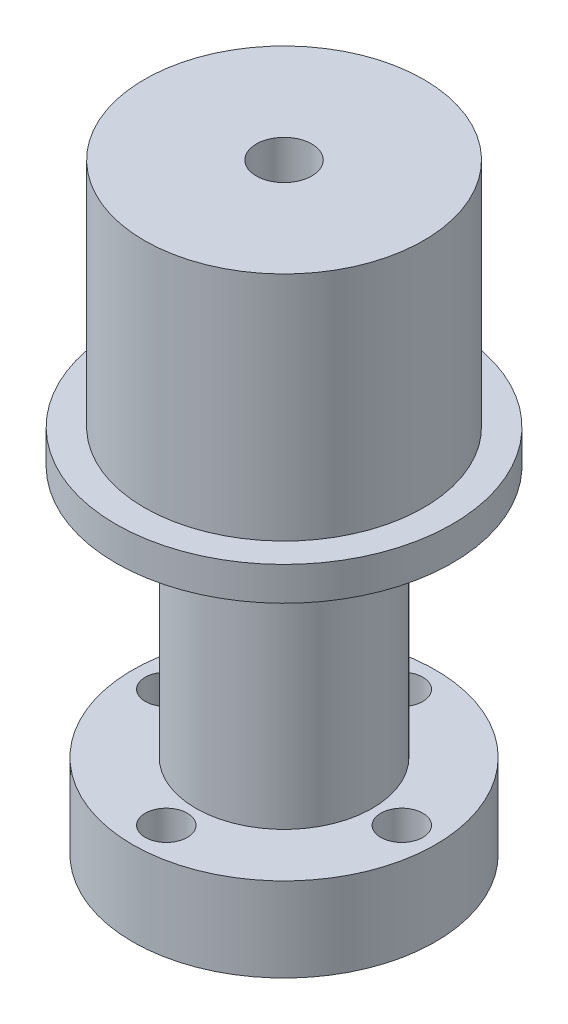
ISO-10303-21;
HEADER;
FILE_DESCRIPTION(('STEP AP214'),'2;1');
FILE_NAME('part.step','',(''),(''),'','','');
FILE_SCHEMA(('AUTOMOTIVE_DESIGN { 1 0 10303 214 1 1 1 1 }'));
ENDSEC;
DATA;
#1=APPLICATION_CONTEXT('core data for automotive mechanical design processes');
#2=APPLICATION_PROTOCOL_DEFINITION('international standard','automotive_design',2000,#1);
#3=PRODUCT_CONTEXT('',#1,'mechanical');
#4=PRODUCT('Part','Part','',(#3));
#5=PRODUCT_RELATED_PRODUCT_CATEGORY('part','',(#4));
#6=PRODUCT_DEFINITION_FORMATION('','',#4);
#7=PRODUCT_DEFINITION_CONTEXT('part definition',#1,'design');
#8=PRODUCT_DEFINITION('design','',#6,#7);
#9=PRODUCT_DEFINITION_SHAPE('','',#8);
#10=(LENGTH_UNIT() NAMED_UNIT(*) SI_UNIT(.MILLI.,.METRE.));
#11=(NAMED_UNIT(*) PLANE_ANGLE_UNIT() SI_UNIT($,.RADIAN.));
#12=(NAMED_UNIT(*) SI_UNIT($,.STERADIAN.) SOLID_ANGLE_UNIT());
#13=UNCERTAINTY_MEASURE_WITH_UNIT(LENGTH_MEASURE(1.E-05),#10,'distance_accuracy_value','');
#14=(GEOMETRIC_REPRESENTATION_CONTEXT(3) GLOBAL_UNCERTAINTY_ASSIGNED_CONTEXT((#13)) GLOBAL_UNIT_ASSIGNED_CONTEXT((#10,
#11,#12)) REPRESENTATION_CONTEXT('',''));
#15=CARTESIAN_POINT('',(0.,0.,0.));
#16=DIRECTION('',(0.,0.,1.));
#17=DIRECTION('',(1.,0.,0.));
#18=AXIS2_PLACEMENT_3D('',#15,#16,#17);
#19=CARTESIAN_POINT('',(0.,0.,0.));
#20=DIRECTION('',(0.,1.,0.));
#21=DIRECTION('',(0.,0.,1.));
#22=AXIS2_PLACEMENT_3D('',#19,#20,#21);
#23=PLANE('',#22);
#24=CARTESIAN_POINT('',(0.,0.,0.));
#25=DIRECTION('',(0.,-1.,0.));
#26=DIRECTION('',(0.,0.,-1.));
#27=AXIS2_PLACEMENT_3D('',#24,#25,#26);
#28=CIRCLE('',#27,5.);
#29=CARTESIAN_POINT('',(0.,0.,-5.));
#30=VERTEX_POINT('',#29);
#31=EDGE_CURVE('E11',#30,#30,#28,.T.);
#32=ORIENTED_EDGE('',*,*,#31,.F.);
#33=EDGE_LOOP('',(#32));
#34=FACE_BOUND('',#33,.T.);
#35=CARTESIAN_POINT('',(0.,0.,-7.));
#36=DIRECTION('',(0.,-1.,0.));
#37=DIRECTION('',(0.,0.,-1.));
#38=AXIS2_PLACEMENT_3D('',#35,#36,#37);
#39=CIRCLE('',#38,1.24999999999999);
#40=CARTESIAN_POINT('',(0.,0.,-8.24999999999999));
#41=VERTEX_POINT('',#40);
#42=EDGE_CURVE('E73',#41,#41,#39,.T.);
#43=ORIENTED_EDGE('',*,*,#42,.F.);
#44=EDGE_LOOP('',(#43));
#45=FACE_BOUND('',#44,.T.);
#46=CARTESIAN_POINT('',(7.,0.,0.));
#47=DIRECTION('',(0.,-1.,0.));
#48=DIRECTION('',(0.,0.,-1.));
#49=AXIS2_PLACEMENT_3D('',#46,#47,#48);
#50=CIRCLE('',#49,1.24999999999999);
#51=CARTESIAN_POINT('',(7.,0.,-1.24999999999999));
#52=VERTEX_POINT('',#51);
#53=EDGE_CURVE('E85',#52,#52,#50,.T.);
#54=ORIENTED_EDGE('',*,*,#53,.F.);
#55=EDGE_LOOP('',(#54));
#56=FACE_BOUND('',#55,.T.);
#57=CARTESIAN_POINT('',(0.,0.,7.));
#58=DIRECTION('',(0.,-1.,0.));
#59=DIRECTION('',(0.,0.,-1.));
#60=AXIS2_PLACEMENT_3D('',#57,#58,#59);
#61=CIRCLE('',#60,1.24999999999999);
#62=CARTESIAN_POINT('',(0.,0.,5.75000000000001));
#63=VERTEX_POINT('',#62);
#64=EDGE_CURVE('E101',#63,#63,#61,.T.);
#65=ORIENTED_EDGE('',*,*,#64,.F.);
#66=EDGE_LOOP('',(#65));
#67=FACE_BOUND('',#66,.T.);
#68=CARTESIAN_POINT('',(0.,0.,0.));
#69=DIRECTION('',(0.,1.,0.));
#70=DIRECTION('',(0.,0.,1.));
#71=AXIS2_PLACEMENT_3D('',#68,#69,#70);
#72=CIRCLE('',#71,9.);
#73=CARTESIAN_POINT('',(0.,0.,9.));
#74=VERTEX_POINT('',#73);
#75=EDGE_CURVE('E47',#74,#74,#72,.T.);
#76=ORIENTED_EDGE('',*,*,#75,.F.);
#77=EDGE_LOOP('',(#76));
#78=FACE_BOUND('',#77,.T.);
#79=CARTESIAN_POINT('',(-7.,0.,0.));
#80=DIRECTION('',(0.,-1.,0.));
#81=DIRECTION('',(0.,0.,-1.));
#82=AXIS2_PLACEMENT_3D('',#79,#80,#81);
#83=CIRCLE('',#82,1.24999999999999);
#84=CARTESIAN_POINT('',(-7.,0.,-1.24999999999999));
#85=VERTEX_POINT('',#84);
#86=EDGE_CURVE('E93',#85,#85,#83,.T.);
#87=ORIENTED_EDGE('',*,*,#86,.F.);
#88=EDGE_LOOP('',(#87));
#89=FACE_BOUND('',#88,.T.);
#90=ADVANCED_FACE('F43',(#34,#45,#56,#67,#78,#89),#23,.F.);
#91=CARTESIAN_POINT('',(0.,5.,0.));
#92=DIRECTION('',(0.,-1.,0.));
#93=DIRECTION('',(0.,0.,-1.));
#94=AXIS2_PLACEMENT_3D('',#91,#92,#93);
#95=CYLINDRICAL_SURFACE('',#94,9.);
#96=CARTESIAN_POINT('',(0.,5.,0.));
#97=DIRECTION('',(0.,1.,0.));
#98=DIRECTION('',(0.,0.,1.));
#99=AXIS2_PLACEMENT_3D('',#96,#97,#98);
#100=CIRCLE('',#99,9.);
#101=CARTESIAN_POINT('',(0.,5.,9.));
#102=VERTEX_POINT('',#101);
#103=EDGE_CURVE('E131',#102,#102,#100,.T.);
#104=ORIENTED_EDGE('',*,*,#103,.F.);
#105=EDGE_LOOP('',(#104));
#106=FACE_BOUND('',#105,.T.);
#107=ORIENTED_EDGE('',*,*,#75,.T.);
#108=EDGE_LOOP('',(#107));
#109=FACE_BOUND('',#108,.T.);
#110=ADVANCED_FACE('F45',(#106,#109),#95,.T.);
#111=CARTESIAN_POINT('',(0.,5.,0.));
#112=DIRECTION('',(0.,1.,0.));
#113=DIRECTION('',(0.,0.,1.));
#114=AXIS2_PLACEMENT_3D('',#111,#112,#113);
#115=PLANE('',#114);
#116=CARTESIAN_POINT('',(0.,5.,-7.));
#117=DIRECTION('',(0.,1.,0.));
#118=DIRECTION('',(0.,0.,1.));
#119=AXIS2_PLACEMENT_3D('',#116,#117,#118);
#120=CIRCLE('',#119,1.24999999999999);
#121=CARTESIAN_POINT('',(0.,5.,-5.75000000000001));
#122=VERTEX_POINT('',#121);
#123=EDGE_CURVE('E81',#122,#122,#120,.T.);
#124=ORIENTED_EDGE('',*,*,#123,.F.);
#125=EDGE_LOOP('',(#124));
#126=FACE_BOUND('',#125,.T.);
#127=CARTESIAN_POINT('',(7.,5.,0.));
#128=DIRECTION('',(0.,1.,0.));
#129=DIRECTION('',(0.,0.,1.));
#130=AXIS2_PLACEMENT_3D('',#127,#128,#129);
#131=CIRCLE('',#130,1.24999999999999);
#132=CARTESIAN_POINT('',(7.,5.,1.25));
#133=VERTEX_POINT('',#132);
#134=EDGE_CURVE('E89',#133,#133,#131,.T.);
#135=ORIENTED_EDGE('',*,*,#134,.F.);
#136=EDGE_LOOP('',(#135));
#137=FACE_BOUND('',#136,.T.);
#138=CARTESIAN_POINT('',(-7.,5.,0.));
#139=DIRECTION('',(0.,1.,0.));
#140=DIRECTION('',(0.,0.,1.));
#141=AXIS2_PLACEMENT_3D('',#138,#139,#140);
#142=CIRCLE('',#141,1.24999999999999);
#143=CARTESIAN_POINT('',(-7.,5.,1.24999999999999));
#144=VERTEX_POINT('',#143);
#145=EDGE_CURVE('E97',#144,#144,#142,.T.);
#146=ORIENTED_EDGE('',*,*,#145,.F.);
#147=EDGE_LOOP('',(#146));
#148=FACE_BOUND('',#147,.T.);
#149=CARTESIAN_POINT('',(0.,5.,7.));
#150=DIRECTION('',(0.,1.,0.));
#151=DIRECTION('',(0.,0.,1.));
#152=AXIS2_PLACEMENT_3D('',#149,#150,#151);
#153=CIRCLE('',#152,1.24999999999999);
#154=CARTESIAN_POINT('',(0.,5.,8.24999999999999));
#155=VERTEX_POINT('',#154);
#156=EDGE_CURVE('E105',#155,#155,#153,.T.);
#157=ORIENTED_EDGE('',*,*,#156,.F.);
#158=EDGE_LOOP('',(#157));
#159=FACE_BOUND('',#158,.T.);
#160=CARTESIAN_POINT('',(0.,5.,0.));
#161=DIRECTION('',(0.,1.,0.));
#162=DIRECTION('',(0.,0.,1.));
#163=AXIS2_PLACEMENT_3D('',#160,#161,#162);
#164=CIRCLE('',#163,5.25);
#165=CARTESIAN_POINT('',(0.,5.,5.25));
#166=VERTEX_POINT('',#165);
#167=EDGE_CURVE('E117',#166,#166,#164,.T.);
#168=ORIENTED_EDGE('',*,*,#167,.F.);
#169=EDGE_LOOP('',(#168));
#170=FACE_BOUND('',#169,.T.);
#171=ORIENTED_EDGE('',*,*,#103,.T.);
#172=EDGE_LOOP('',(#171));
#173=FACE_BOUND('',#172,.T.);
#174=ADVANCED_FACE('F154',(#126,#137,#148,#159,#170,#173),#115,.T.);
#175=CARTESIAN_POINT('',(0.,20.,0.));
#176=DIRECTION('',(0.,-1.,0.));
#177=DIRECTION('',(0.,0.,-1.));
#178=AXIS2_PLACEMENT_3D('',#175,#176,#177);
#179=CYLINDRICAL_SURFACE('',#178,5.25);
#180=CARTESIAN_POINT('',(0.,20.,0.));
#181=DIRECTION('',(0.,1.,0.));
#182=DIRECTION('',(0.,0.,1.));
#183=AXIS2_PLACEMENT_3D('',#180,#181,#182);
#184=CIRCLE('',#183,5.25);
#185=CARTESIAN_POINT('',(0.,20.,5.25));
#186=VERTEX_POINT('',#185);
#187=EDGE_CURVE('E122',#186,#186,#184,.T.);
#188=ORIENTED_EDGE('',*,*,#187,.F.);
#189=EDGE_LOOP('',(#188));
#190=FACE_BOUND('',#189,.T.);
#191=ORIENTED_EDGE('',*,*,#167,.T.);
#192=EDGE_LOOP('',(#191));
#193=FACE_BOUND('',#192,.T.);
#194=ADVANCED_FACE('F157',(#190,#193),#179,.T.);
#195=CARTESIAN_POINT('',(0.,22.,0.));
#196=DIRECTION('',(0.,-1.,0.));
#197=DIRECTION('',(0.,0.,-1.));
#198=AXIS2_PLACEMENT_3D('',#195,#196,#197);
#199=CYLINDRICAL_SURFACE('',#198,10.);
#200=CARTESIAN_POINT('',(0.,22.,0.));
#201=DIRECTION('',(0.,1.,0.));
#202=DIRECTION('',(0.,0.,1.));
#203=AXIS2_PLACEMENT_3D('',#200,#201,#202);
#204=CIRCLE('',#203,10.);
#205=CARTESIAN_POINT('',(0.,22.,10.));
#206=VERTEX_POINT('',#205);
#207=EDGE_CURVE('E118',#206,#206,#204,.T.);
#208=ORIENTED_EDGE('',*,*,#207,.F.);
#209=EDGE_LOOP('',(#208));
#210=FACE_BOUND('',#209,.T.);
#211=CARTESIAN_POINT('',(0.,20.,0.));
#212=DIRECTION('',(0.,1.,0.));
#213=DIRECTION('',(0.,0.,1.));
#214=AXIS2_PLACEMENT_3D('',#211,#212,#213);
#215=CIRCLE('',#214,10.);
#216=CARTESIAN_POINT('',(0.,20.,10.));
#217=VERTEX_POINT('',#216);
#218=EDGE_CURVE('E113',#217,#217,#215,.T.);
#219=ORIENTED_EDGE('',*,*,#218,.T.);
#220=EDGE_LOOP('',(#219));
#221=FACE_BOUND('',#220,.T.);
#222=ADVANCED_FACE('F165',(#210,#221),#199,.T.);
#223=CARTESIAN_POINT('',(0.,22.,0.));
#224=DIRECTION('',(0.,1.,0.));
#225=DIRECTION('',(0.,0.,1.));
#226=AXIS2_PLACEMENT_3D('',#223,#224,#225);
#227=PLANE('',#226);
#228=CARTESIAN_POINT('',(0.,22.,0.));
#229=DIRECTION('',(0.,1.,0.));
#230=DIRECTION('',(0.,0.,1.));
#231=AXIS2_PLACEMENT_3D('',#228,#229,#230);
#232=CIRCLE('',#231,8.3);
#233=CARTESIAN_POINT('',(0.,22.,8.3));
#234=VERTEX_POINT('',#233);
#235=EDGE_CURVE('E52',#234,#234,#232,.T.);
#236=ORIENTED_EDGE('',*,*,#235,.F.);
#237=EDGE_LOOP('',(#236));
#238=FACE_BOUND('',#237,.T.);
#239=ORIENTED_EDGE('',*,*,#207,.T.);
#240=EDGE_LOOP('',(#239));
#241=FACE_BOUND('',#240,.T.);
#242=ADVANCED_FACE('F171',(#238,#241),#227,.T.);
#243=CARTESIAN_POINT('',(0.,20.,0.));
#244=DIRECTION('',(0.,1.,0.));
#245=DIRECTION('',(0.,0.,1.));
#246=AXIS2_PLACEMENT_3D('',#243,#244,#245);
#247=PLANE('',#246);
#248=ORIENTED_EDGE('',*,*,#187,.T.);
#249=EDGE_LOOP('',(#248));
#250=FACE_BOUND('',#249,.T.);
#251=ORIENTED_EDGE('',*,*,#218,.F.);
#252=EDGE_LOOP('',(#251));
#253=FACE_BOUND('',#252,.T.);
#254=ADVANCED_FACE('F176',(#250,#253),#247,.F.);
#255=CARTESIAN_POINT('',(0.,35.75,0.));
#256=DIRECTION('',(0.,-1.,0.));
#257=DIRECTION('',(0.,0.,-1.));
#258=AXIS2_PLACEMENT_3D('',#255,#256,#257);
#259=CYLINDRICAL_SURFACE('',#258,8.3);
#260=CARTESIAN_POINT('',(0.,35.75,0.));
#261=DIRECTION('',(0.,1.,0.));
#262=DIRECTION('',(0.,0.,1.));
#263=AXIS2_PLACEMENT_3D('',#260,#261,#262);
#264=CIRCLE('',#263,8.3);
#265=CARTESIAN_POINT('',(0.,35.75,8.3));
#266=VERTEX_POINT('',#265);
#267=EDGE_CURVE('E109',#266,#266,#264,.T.);
#268=ORIENTED_EDGE('',*,*,#267,.F.);
#269=EDGE_LOOP('',(#268));
#270=FACE_BOUND('',#269,.T.);
#271=ORIENTED_EDGE('',*,*,#235,.T.);
#272=EDGE_LOOP('',(#271));
#273=FACE_BOUND('',#272,.T.);
#274=ADVANCED_FACE('F179',(#270,#273),#259,.T.);
#275=CARTESIAN_POINT('',(0.,35.75,0.));
#276=DIRECTION('',(0.,1.,0.));
#277=DIRECTION('',(0.,0.,1.));
#278=AXIS2_PLACEMENT_3D('',#275,#276,#277);
#279=PLANE('',#278);
#280=CARTESIAN_POINT('',(0.,35.75,0.));
#281=DIRECTION('',(0.,1.,0.));
#282=DIRECTION('',(0.,0.,1.));
#283=AXIS2_PLACEMENT_3D('',#280,#281,#282);
#284=CIRCLE('',#283,1.65);
#285=CARTESIAN_POINT('',(0.,35.75,1.65));
#286=VERTEX_POINT('',#285);
#287=EDGE_CURVE('E68',#286,#286,#284,.T.);
#288=ORIENTED_EDGE('',*,*,#287,.F.);
#289=EDGE_LOOP('',(#288));
#290=FACE_BOUND('',#289,.T.);
#291=ORIENTED_EDGE('',*,*,#267,.T.);
#292=EDGE_LOOP('',(#291));
#293=FACE_BOUND('',#292,.T.);
#294=ADVANCED_FACE('F186',(#290,#293),#279,.T.);
#295=CARTESIAN_POINT('',(0.,0.,7.));
#296=DIRECTION('',(0.,-1.,0.));
#297=DIRECTION('',(0.,0.,-1.));
#298=AXIS2_PLACEMENT_3D('',#295,#296,#297);
#299=CYLINDRICAL_SURFACE('',#298,1.24999999999999);
#300=ORIENTED_EDGE('',*,*,#64,.T.);
#301=EDGE_LOOP('',(#300));
#302=FACE_BOUND('',#301,.T.);
#303=ORIENTED_EDGE('',*,*,#156,.T.);
#304=EDGE_LOOP('',(#303));
#305=FACE_BOUND('',#304,.T.);
#306=ADVANCED_FACE('F150',(#302,#305),#299,.F.);
#307=CARTESIAN_POINT('',(-7.,0.,0.));
#308=DIRECTION('',(0.,-1.,0.));
#309=DIRECTION('',(0.,0.,-1.));
#310=AXIS2_PLACEMENT_3D('',#307,#308,#309);
#311=CYLINDRICAL_SURFACE('',#310,1.24999999999999);
#312=ORIENTED_EDGE('',*,*,#86,.T.);
#313=EDGE_LOOP('',(#312));
#314=FACE_BOUND('',#313,.T.);
#315=ORIENTED_EDGE('',*,*,#145,.T.);
#316=EDGE_LOOP('',(#315));
#317=FACE_BOUND('',#316,.T.);
#318=ADVANCED_FACE('F146',(#314,#317),#311,.F.);
#319=CARTESIAN_POINT('',(7.,0.,0.));
#320=DIRECTION('',(0.,-1.,0.));
#321=DIRECTION('',(0.,0.,-1.));
#322=AXIS2_PLACEMENT_3D('',#319,#320,#321);
#323=CYLINDRICAL_SURFACE('',#322,1.24999999999999);
#324=ORIENTED_EDGE('',*,*,#53,.T.);
#325=EDGE_LOOP('',(#324));
#326=FACE_BOUND('',#325,.T.);
#327=ORIENTED_EDGE('',*,*,#134,.T.);
#328=EDGE_LOOP('',(#327));
#329=FACE_BOUND('',#328,.T.);
#330=ADVANCED_FACE('F149',(#326,#329),#323,.F.);
#331=CARTESIAN_POINT('',(0.,0.,-7.));
#332=DIRECTION('',(0.,-1.,0.));
#333=DIRECTION('',(0.,0.,-1.));
#334=AXIS2_PLACEMENT_3D('',#331,#332,#333);
#335=CYLINDRICAL_SURFACE('',#334,1.24999999999999);
#336=ORIENTED_EDGE('',*,*,#42,.T.);
#337=EDGE_LOOP('',(#336));
#338=FACE_BOUND('',#337,.T.);
#339=ORIENTED_EDGE('',*,*,#123,.T.);
#340=EDGE_LOOP('',(#339));
#341=FACE_BOUND('',#340,.T.);
#342=ADVANCED_FACE('F196',(#338,#341),#335,.F.);
#343=CARTESIAN_POINT('',(0.,-2.,0.));
#344=DIRECTION('',(0.,1.,0.));
#345=DIRECTION('',(0.,0.,1.));
#346=AXIS2_PLACEMENT_3D('',#343,#344,#345);
#347=CYLINDRICAL_SURFACE('',#346,5.);
#348=CARTESIAN_POINT('',(0.,-2.,0.));
#349=DIRECTION('',(0.,-1.,0.));
#350=DIRECTION('',(0.,0.,-1.));
#351=AXIS2_PLACEMENT_3D('',#348,#349,#350);
#352=CIRCLE('',#351,5.);
#353=CARTESIAN_POINT('',(0.,-2.,-5.));
#354=VERTEX_POINT('',#353);
#355=EDGE_CURVE('E67',#354,#354,#352,.T.);
#356=ORIENTED_EDGE('',*,*,#355,.F.);
#357=EDGE_LOOP('',(#356));
#358=FACE_BOUND('',#357,.T.);
#359=ORIENTED_EDGE('',*,*,#31,.T.);
#360=EDGE_LOOP('',(#359));
#361=FACE_BOUND('',#360,.T.);
#362=ADVANCED_FACE('F200',(#358,#361),#347,.T.);
#363=CARTESIAN_POINT('',(0.,-2.,0.));
#364=DIRECTION('',(0.,-1.,0.));
#365=DIRECTION('',(0.,0.,-1.));
#366=AXIS2_PLACEMENT_3D('',#363,#364,#365);
#367=PLANE('',#366);
#368=ORIENTED_EDGE('',*,*,#355,.T.);
#369=EDGE_LOOP('',(#368));
#370=FACE_BOUND('',#369,.T.);
#371=ADVANCED_FACE('F60',(#370),#367,.T.);
#372=CARTESIAN_POINT('',(0.,25.65,0.));
#373=DIRECTION('',(0.,1.,0.));
#374=DIRECTION('',(0.,0.,1.));
#375=AXIS2_PLACEMENT_3D('',#372,#373,#374);
#376=CONICAL_SURFACE('',#375,1.65,1.02974425867665);
#377=CARTESIAN_POINT('',(0.,24.6585799786045,0.));
#378=VERTEX_POINT('',#377);
#379=VERTEX_LOOP('',#378);
#380=FACE_BOUND('',#379,.T.);
#381=CARTESIAN_POINT('',(0.,25.65,0.));
#382=DIRECTION('',(0.,1.,0.));
#383=DIRECTION('',(0.,0.,1.));
#384=AXIS2_PLACEMENT_3D('',#381,#382,#383);
#385=CIRCLE('',#384,1.65);
#386=CARTESIAN_POINT('',(0.,25.65,1.65));
#387=VERTEX_POINT('',#386);
#388=EDGE_CURVE('E64',#387,#387,#385,.T.);
#389=ORIENTED_EDGE('',*,*,#388,.T.);
#390=EDGE_LOOP('',(#389));
#391=FACE_BOUND('',#390,.T.);
#392=ADVANCED_FACE('F56',(#380,#391),#376,.F.);
#393=CARTESIAN_POINT('',(0.,35.75,0.));
#394=DIRECTION('',(0.,1.,0.));
#395=DIRECTION('',(0.,0.,1.));
#396=AXIS2_PLACEMENT_3D('',#393,#394,#395);
#397=CYLINDRICAL_SURFACE('',#396,1.65);
#398=ORIENTED_EDGE('',*,*,#388,.F.);
#399=EDGE_LOOP('',(#398));
#400=FACE_BOUND('',#399,.T.);
#401=ORIENTED_EDGE('',*,*,#287,.T.);
#402=EDGE_LOOP('',(#401));
#403=FACE_BOUND('',#402,.T.);
#404=ADVANCED_FACE('F59',(#400,#403),#397,.F.);
#405=CLOSED_SHELL('',(#90,#110,#174,#194,#222,#242,#254,#274,#294,#306,#318,#330,#342,#362,#371,
#392,#404));
#406=MANIFOLD_SOLID_BREP('B2',#405);
#407=ADVANCED_BREP_SHAPE_REPRESENTATION('',(#18,#406),#14);
#408=SHAPE_DEFINITION_REPRESENTATION(#9,#407);
ENDSEC;
END-ISO-10303-21;
